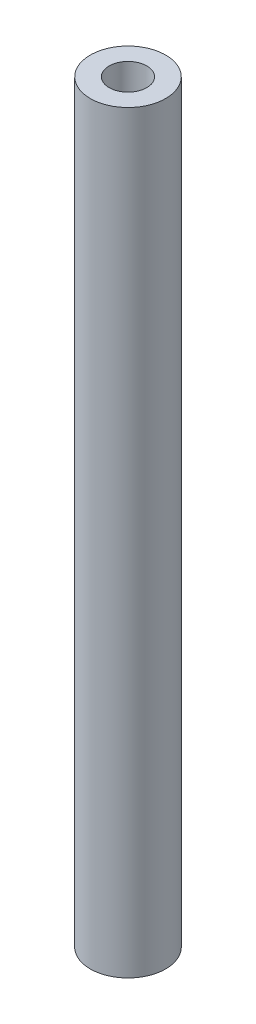
ISO-10303-21;
HEADER;
FILE_DESCRIPTION(('STEP AP214'),'2;1');
FILE_NAME('part.step','',(''),(''),'','','');
FILE_SCHEMA(('AUTOMOTIVE_DESIGN { 1 0 10303 214 1 1 1 1 }'));
ENDSEC;
DATA;
#1=APPLICATION_CONTEXT('core data for automotive mechanical design processes');
#2=APPLICATION_PROTOCOL_DEFINITION('international standard','automotive_design',2000,#1);
#3=PRODUCT_CONTEXT('',#1,'mechanical');
#4=PRODUCT('Part','Part','',(#3));
#5=PRODUCT_RELATED_PRODUCT_CATEGORY('part','',(#4));
#6=PRODUCT_DEFINITION_FORMATION('','',#4);
#7=PRODUCT_DEFINITION_CONTEXT('part definition',#1,'design');
#8=PRODUCT_DEFINITION('design','',#6,#7);
#9=PRODUCT_DEFINITION_SHAPE('','',#8);
#10=(LENGTH_UNIT() NAMED_UNIT(*) SI_UNIT(.MILLI.,.METRE.));
#11=(NAMED_UNIT(*) PLANE_ANGLE_UNIT() SI_UNIT($,.RADIAN.));
#12=(NAMED_UNIT(*) SI_UNIT($,.STERADIAN.) SOLID_ANGLE_UNIT());
#13=UNCERTAINTY_MEASURE_WITH_UNIT(LENGTH_MEASURE(1.E-05),#10,'distance_accuracy_value','');
#14=(GEOMETRIC_REPRESENTATION_CONTEXT(3) GLOBAL_UNCERTAINTY_ASSIGNED_CONTEXT((#13)) GLOBAL_UNIT_ASSIGNED_CONTEXT((#10,
#11,#12)) REPRESENTATION_CONTEXT('',''));
#15=CARTESIAN_POINT('',(0.,0.,0.));
#16=DIRECTION('',(0.,0.,1.));
#17=DIRECTION('',(1.,0.,0.));
#18=AXIS2_PLACEMENT_3D('',#15,#16,#17);
#19=CARTESIAN_POINT('',(0.,60.,0.));
#20=DIRECTION('',(0.,1.,0.));
#21=DIRECTION('',(0.,0.,1.));
#22=AXIS2_PLACEMENT_3D('',#19,#20,#21);
#23=PLANE('',#22);
#24=CARTESIAN_POINT('',(0.,60.,0.));
#25=DIRECTION('',(0.,1.,0.));
#26=DIRECTION('',(0.,0.,1.));
#27=AXIS2_PLACEMENT_3D('',#24,#25,#26);
#28=CIRCLE('',#27,3.);
#29=CARTESIAN_POINT('',(0.,60.,3.));
#30=VERTEX_POINT('',#29);
#31=EDGE_CURVE('E10',#30,#30,#28,.T.);
#32=ORIENTED_EDGE('',*,*,#31,.T.);
#33=EDGE_LOOP('',(#32));
#34=FACE_BOUND('',#33,.T.);
#35=CARTESIAN_POINT('',(0.,60.,0.));
#36=DIRECTION('',(0.,1.,0.));
#37=DIRECTION('',(0.,0.,1.));
#38=AXIS2_PLACEMENT_3D('',#35,#36,#37);
#39=CIRCLE('',#38,1.5);
#40=CARTESIAN_POINT('',(0.,60.,1.5));
#41=VERTEX_POINT('',#40);
#42=EDGE_CURVE('E52',#41,#41,#39,.T.);
#43=ORIENTED_EDGE('',*,*,#42,.F.);
#44=EDGE_LOOP('',(#43));
#45=FACE_BOUND('',#44,.T.);
#46=ADVANCED_FACE('F39',(#34,#45),#23,.T.);
#47=CARTESIAN_POINT('',(0.,0.,0.));
#48=DIRECTION('',(0.,1.,0.));
#49=DIRECTION('',(0.,0.,1.));
#50=AXIS2_PLACEMENT_3D('',#47,#48,#49);
#51=PLANE('',#50);
#52=CARTESIAN_POINT('',(0.,0.,0.));
#53=DIRECTION('',(0.,1.,0.));
#54=DIRECTION('',(0.,0.,1.));
#55=AXIS2_PLACEMENT_3D('',#52,#53,#54);
#56=CIRCLE('',#55,3.);
#57=CARTESIAN_POINT('',(0.,0.,3.));
#58=VERTEX_POINT('',#57);
#59=EDGE_CURVE('E43',#58,#58,#56,.T.);
#60=ORIENTED_EDGE('',*,*,#59,.F.);
#61=EDGE_LOOP('',(#60));
#62=FACE_BOUND('',#61,.T.);
#63=CARTESIAN_POINT('',(0.,0.,0.));
#64=DIRECTION('',(0.,1.,0.));
#65=DIRECTION('',(0.,0.,1.));
#66=AXIS2_PLACEMENT_3D('',#63,#64,#65);
#67=CIRCLE('',#66,1.5);
#68=CARTESIAN_POINT('',(0.,0.,1.5));
#69=VERTEX_POINT('',#68);
#70=EDGE_CURVE('E54',#69,#69,#67,.T.);
#71=ORIENTED_EDGE('',*,*,#70,.T.);
#72=EDGE_LOOP('',(#71));
#73=FACE_BOUND('',#72,.T.);
#74=ADVANCED_FACE('F66',(#62,#73),#51,.F.);
#75=CARTESIAN_POINT('',(0.,60.,0.));
#76=DIRECTION('',(0.,-1.,0.));
#77=DIRECTION('',(0.,0.,-1.));
#78=AXIS2_PLACEMENT_3D('',#75,#76,#77);
#79=CYLINDRICAL_SURFACE('',#78,3.);
#80=ORIENTED_EDGE('',*,*,#31,.F.);
#81=EDGE_LOOP('',(#80));
#82=FACE_BOUND('',#81,.T.);
#83=ORIENTED_EDGE('',*,*,#59,.T.);
#84=EDGE_LOOP('',(#83));
#85=FACE_BOUND('',#84,.T.);
#86=ADVANCED_FACE('F41',(#82,#85),#79,.T.);
#87=CARTESIAN_POINT('',(0.,60.,0.));
#88=DIRECTION('',(0.,-1.,0.));
#89=DIRECTION('',(0.,0.,-1.));
#90=AXIS2_PLACEMENT_3D('',#87,#88,#89);
#91=CYLINDRICAL_SURFACE('',#90,1.5);
#92=ORIENTED_EDGE('',*,*,#42,.T.);
#93=EDGE_LOOP('',(#92));
#94=FACE_BOUND('',#93,.T.);
#95=ORIENTED_EDGE('',*,*,#70,.F.);
#96=EDGE_LOOP('',(#95));
#97=FACE_BOUND('',#96,.T.);
#98=ADVANCED_FACE('F62',(#94,#97),#91,.F.);
#99=CLOSED_SHELL('',(#46,#74,#86,#98));
#100=MANIFOLD_SOLID_BREP('B2',#99);
#101=ADVANCED_BREP_SHAPE_REPRESENTATION('',(#18,#100),#14);
#102=SHAPE_DEFINITION_REPRESENTATION(#9,#101);
ENDSEC;
END-ISO-10303-21;
